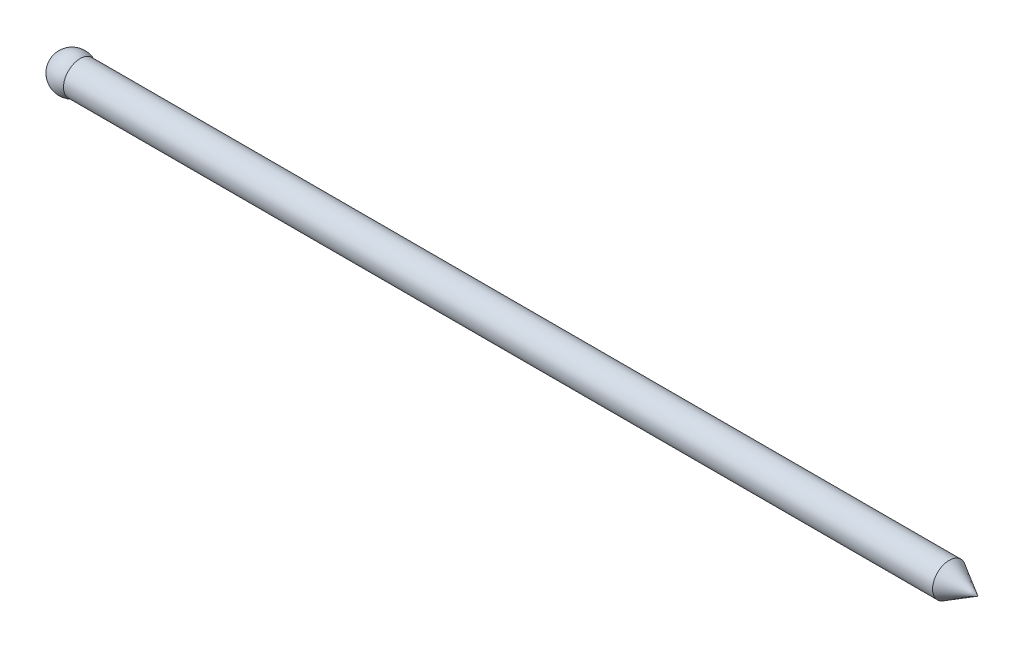
ISO-10303-21;
HEADER;
FILE_DESCRIPTION(('STEP AP214'),'2;1');
FILE_NAME('part.step','',(''),(''),'','','');
FILE_SCHEMA(('AUTOMOTIVE_DESIGN { 1 0 10303 214 1 1 1 1 }'));
ENDSEC;
DATA;
#1=APPLICATION_CONTEXT('core data for automotive mechanical design processes');
#2=APPLICATION_PROTOCOL_DEFINITION('international standard','automotive_design',2000,#1);
#3=PRODUCT_CONTEXT('',#1,'mechanical');
#4=PRODUCT('Part','Part','',(#3));
#5=PRODUCT_RELATED_PRODUCT_CATEGORY('part','',(#4));
#6=PRODUCT_DEFINITION_FORMATION('','',#4);
#7=PRODUCT_DEFINITION_CONTEXT('part definition',#1,'design');
#8=PRODUCT_DEFINITION('design','',#6,#7);
#9=PRODUCT_DEFINITION_SHAPE('','',#8);
#10=(LENGTH_UNIT() NAMED_UNIT(*) SI_UNIT(.MILLI.,.METRE.));
#11=(NAMED_UNIT(*) PLANE_ANGLE_UNIT() SI_UNIT($,.RADIAN.));
#12=(NAMED_UNIT(*) SI_UNIT($,.STERADIAN.) SOLID_ANGLE_UNIT());
#13=UNCERTAINTY_MEASURE_WITH_UNIT(LENGTH_MEASURE(1.E-05),#10,'distance_accuracy_value','');
#14=(GEOMETRIC_REPRESENTATION_CONTEXT(3) GLOBAL_UNCERTAINTY_ASSIGNED_CONTEXT((#13)) GLOBAL_UNIT_ASSIGNED_CONTEXT((#10,
#11,#12)) REPRESENTATION_CONTEXT('',''));
#15=CARTESIAN_POINT('',(0.,0.,0.));
#16=DIRECTION('',(0.,0.,1.));
#17=DIRECTION('',(1.,0.,0.));
#18=AXIS2_PLACEMENT_3D('',#15,#16,#17);
#19=CARTESIAN_POINT('',(0.,0.,0.));
#20=DIRECTION('',(-1.,0.,0.));
#21=DIRECTION('',(0.,0.,-1.));
#22=AXIS2_PLACEMENT_3D('',#19,#20,#21);
#23=SPHERICAL_SURFACE('',#22,6.35);
#24=CARTESIAN_POINT('',(2.76790082914833,0.,0.));
#25=DIRECTION('',(-1.,0.,0.));
#26=DIRECTION('',(0.,0.,1.));
#27=AXIS2_PLACEMENT_3D('',#24,#25,#26);
#28=CIRCLE('',#27,5.715);
#29=CARTESIAN_POINT('',(2.76790082914833,0.,5.715));
#30=VERTEX_POINT('',#29);
#31=EDGE_CURVE('E11',#30,#30,#28,.T.);
#32=ORIENTED_EDGE('',*,*,#31,.T.);
#33=EDGE_LOOP('',(#32));
#34=FACE_BOUND('',#33,.T.);
#35=ADVANCED_FACE('F41',(#34),#23,.T.);
#36=CARTESIAN_POINT('',(-6.35,0.,0.));
#37=DIRECTION('',(-1.,0.,0.));
#38=DIRECTION('',(0.,0.,1.));
#39=AXIS2_PLACEMENT_3D('',#36,#37,#38);
#40=CYLINDRICAL_SURFACE('',#39,5.715);
#41=CARTESIAN_POINT('',(301.251329634744,0.,0.));
#42=DIRECTION('',(-1.,0.,0.));
#43=DIRECTION('',(0.,0.,1.));
#44=AXIS2_PLACEMENT_3D('',#41,#42,#43);
#45=CIRCLE('',#44,5.715);
#46=CARTESIAN_POINT('',(301.251329634744,0.,5.715));
#47=VERTEX_POINT('',#46);
#48=EDGE_CURVE('E47',#47,#47,#45,.T.);
#49=ORIENTED_EDGE('',*,*,#48,.T.);
#50=EDGE_LOOP('',(#49));
#51=FACE_BOUND('',#50,.T.);
#52=ORIENTED_EDGE('',*,*,#31,.F.);
#53=EDGE_LOOP('',(#52));
#54=FACE_BOUND('',#53,.T.);
#55=ADVANCED_FACE('F53',(#51,#54),#40,.T.);
#56=CARTESIAN_POINT('',(301.251329634744,0.,0.));
#57=DIRECTION('',(-1.,0.,0.));
#58=DIRECTION('',(0.,0.,1.));
#59=AXIS2_PLACEMENT_3D('',#56,#57,#58);
#60=CONICAL_SURFACE('',#59,5.715,0.5235987755983);
#61=CARTESIAN_POINT('',(311.15,0.,0.));
#62=VERTEX_POINT('',#61);
#63=VERTEX_LOOP('',#62);
#64=FACE_BOUND('',#63,.T.);
#65=ORIENTED_EDGE('',*,*,#48,.F.);
#66=EDGE_LOOP('',(#65));
#67=FACE_BOUND('',#66,.T.);
#68=ADVANCED_FACE('F50',(#64,#67),#60,.T.);
#69=CLOSED_SHELL('',(#35,#55,#68));
#70=MANIFOLD_SOLID_BREP('B2',#69);
#71=ADVANCED_BREP_SHAPE_REPRESENTATION('',(#18,#70),#14);
#72=SHAPE_DEFINITION_REPRESENTATION(#9,#71);
ENDSEC;
END-ISO-10303-21;
